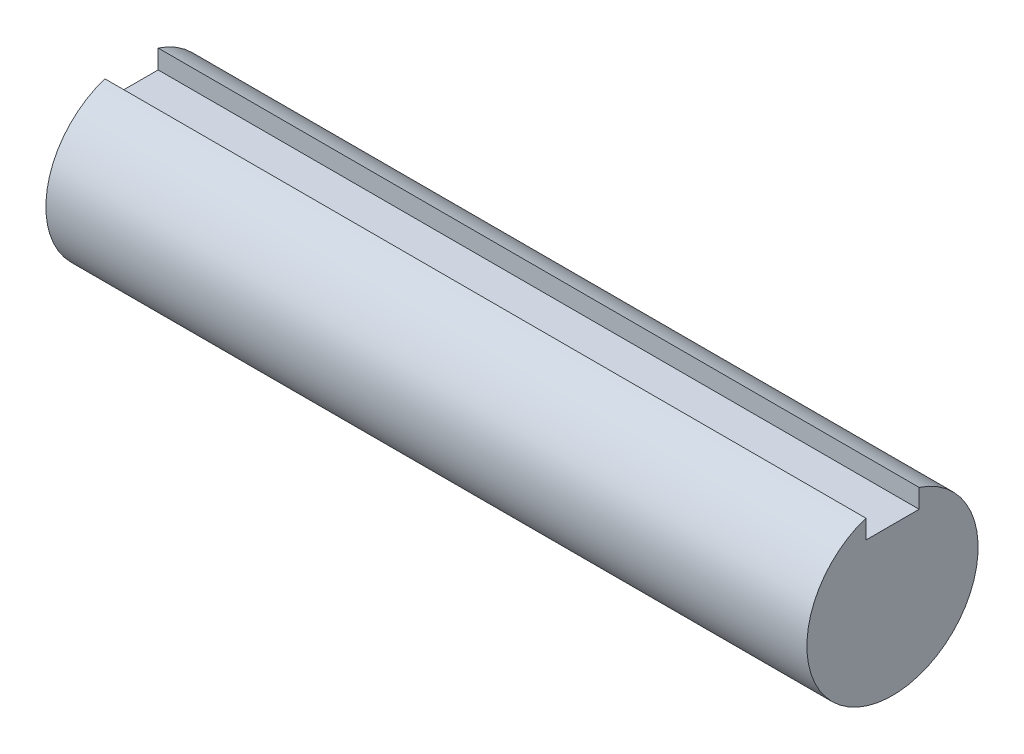
ISO-10303-21;
HEADER;
FILE_DESCRIPTION(('STEP AP214'),'2;1');
FILE_NAME('part.step','',(''),(''),'','','');
FILE_SCHEMA(('AUTOMOTIVE_DESIGN { 1 0 10303 214 1 1 1 1 }'));
ENDSEC;
DATA;
#1=APPLICATION_CONTEXT('core data for automotive mechanical design processes');
#2=APPLICATION_PROTOCOL_DEFINITION('international standard','automotive_design',2000,#1);
#3=PRODUCT_CONTEXT('',#1,'mechanical');
#4=PRODUCT('Part','Part','',(#3));
#5=PRODUCT_RELATED_PRODUCT_CATEGORY('part','',(#4));
#6=PRODUCT_DEFINITION_FORMATION('','',#4);
#7=PRODUCT_DEFINITION_CONTEXT('part definition',#1,'design');
#8=PRODUCT_DEFINITION('design','',#6,#7);
#9=PRODUCT_DEFINITION_SHAPE('','',#8);
#10=(LENGTH_UNIT() NAMED_UNIT(*) SI_UNIT(.MILLI.,.METRE.));
#11=(NAMED_UNIT(*) PLANE_ANGLE_UNIT() SI_UNIT($,.RADIAN.));
#12=(NAMED_UNIT(*) SI_UNIT($,.STERADIAN.) SOLID_ANGLE_UNIT());
#13=UNCERTAINTY_MEASURE_WITH_UNIT(LENGTH_MEASURE(1.E-05),#10,'distance_accuracy_value','');
#14=(GEOMETRIC_REPRESENTATION_CONTEXT(3) GLOBAL_UNCERTAINTY_ASSIGNED_CONTEXT((#13)) GLOBAL_UNIT_ASSIGNED_CONTEXT((#10,
#11,#12)) REPRESENTATION_CONTEXT('',''));
#15=CARTESIAN_POINT('',(0.,0.,0.));
#16=DIRECTION('',(0.,0.,1.));
#17=DIRECTION('',(1.,0.,0.));
#18=AXIS2_PLACEMENT_3D('',#15,#16,#17);
#19=CARTESIAN_POINT('',(200.,21.3834047803431,7.));
#20=DIRECTION('',(0.,0.,-1.));
#21=DIRECTION('',(-1.,0.,0.));
#22=AXIS2_PLACEMENT_3D('',#19,#20,#21);
#23=PLANE('',#22);
#24=DIRECTION('',(0.,-1.,0.));
#25=VECTOR('',#24,1.);
#26=CARTESIAN_POINT('',(0.,21.3834047803431,7.));
#27=LINE('',#26,#25);
#28=CARTESIAN_POINT('',(0.,21.3834047803431,7.));
#29=VERTEX_POINT('',#28);
#30=CARTESIAN_POINT('',(0.,16.4,7.));
#31=VERTEX_POINT('',#30);
#32=EDGE_CURVE('E102',#29,#31,#27,.T.);
#33=ORIENTED_EDGE('',*,*,#32,.F.);
#34=DIRECTION('',(-1.,0.,0.));
#35=VECTOR('',#34,1.);
#36=CARTESIAN_POINT('',(200.,21.3834047803431,7.));
#37=LINE('',#36,#35);
#38=CARTESIAN_POINT('',(200.,21.3834047803431,7.));
#39=VERTEX_POINT('',#38);
#40=EDGE_CURVE('E11',#39,#29,#37,.T.);
#41=ORIENTED_EDGE('',*,*,#40,.F.);
#42=DIRECTION('',(0.,-1.,0.));
#43=VECTOR('',#42,1.);
#44=CARTESIAN_POINT('',(200.,21.3834047803431,7.));
#45=LINE('',#44,#43);
#46=CARTESIAN_POINT('',(200.,16.4,7.));
#47=VERTEX_POINT('',#46);
#48=EDGE_CURVE('E97',#39,#47,#45,.T.);
#49=ORIENTED_EDGE('',*,*,#48,.T.);
#50=DIRECTION('',(-1.,0.,0.));
#51=VECTOR('',#50,1.);
#52=CARTESIAN_POINT('',(200.,16.4,7.));
#53=LINE('',#52,#51);
#54=EDGE_CURVE('E40',#47,#31,#53,.T.);
#55=ORIENTED_EDGE('',*,*,#54,.T.);
#56=EDGE_LOOP('',(#33,#41,#49,#55));
#57=FACE_BOUND('',#56,.T.);
#58=ADVANCED_FACE('F37',(#57),#23,.T.);
#59=CARTESIAN_POINT('',(200.,0.,0.));
#60=DIRECTION('',(-1.,0.,0.));
#61=DIRECTION('',(0.,0.,1.));
#62=AXIS2_PLACEMENT_3D('',#59,#60,#61);
#63=CYLINDRICAL_SURFACE('',#62,22.5);
#64=CARTESIAN_POINT('',(0.,0.,0.));
#65=DIRECTION('',(1.,0.,0.));
#66=DIRECTION('',(0.,0.,-1.));
#67=AXIS2_PLACEMENT_3D('',#64,#65,#66);
#68=CIRCLE('',#67,22.5);
#69=CARTESIAN_POINT('',(0.,21.3834047803431,-7.));
#70=VERTEX_POINT('',#69);
#71=EDGE_CURVE('E70',#29,#70,#68,.T.);
#72=ORIENTED_EDGE('',*,*,#71,.T.);
#73=DIRECTION('',(-1.,0.,0.));
#74=VECTOR('',#73,1.);
#75=CARTESIAN_POINT('',(200.,21.3834047803431,-7.));
#76=LINE('',#75,#74);
#77=CARTESIAN_POINT('',(200.,21.3834047803431,-7.));
#78=VERTEX_POINT('',#77);
#79=EDGE_CURVE('E46',#78,#70,#76,.T.);
#80=ORIENTED_EDGE('',*,*,#79,.F.);
#81=CARTESIAN_POINT('',(200.,0.,0.));
#82=DIRECTION('',(1.,0.,0.));
#83=DIRECTION('',(0.,0.,-1.));
#84=AXIS2_PLACEMENT_3D('',#81,#82,#83);
#85=CIRCLE('',#84,22.5);
#86=EDGE_CURVE('E87',#39,#78,#85,.T.);
#87=ORIENTED_EDGE('',*,*,#86,.F.);
#88=ORIENTED_EDGE('',*,*,#40,.T.);
#89=EDGE_LOOP('',(#72,#80,#87,#88));
#90=FACE_BOUND('',#89,.T.);
#91=ADVANCED_FACE('F112',(#90),#63,.T.);
#92=CARTESIAN_POINT('',(200.,21.3834047803431,-7.));
#93=DIRECTION('',(0.,0.,-1.));
#94=DIRECTION('',(0.,1.,0.));
#95=AXIS2_PLACEMENT_3D('',#92,#93,#94);
#96=PLANE('',#95);
#97=DIRECTION('',(0.,-1.,0.));
#98=VECTOR('',#97,1.);
#99=CARTESIAN_POINT('',(0.,21.3834047803431,-7.));
#100=LINE('',#99,#98);
#101=CARTESIAN_POINT('',(0.,16.4,-7.));
#102=VERTEX_POINT('',#101);
#103=EDGE_CURVE('E94',#70,#102,#100,.T.);
#104=ORIENTED_EDGE('',*,*,#103,.T.);
#105=DIRECTION('',(-1.,0.,0.));
#106=VECTOR('',#105,1.);
#107=CARTESIAN_POINT('',(200.,16.4,-7.));
#108=LINE('',#107,#106);
#109=CARTESIAN_POINT('',(200.,16.4,-7.));
#110=VERTEX_POINT('',#109);
#111=EDGE_CURVE('E91',#110,#102,#108,.T.);
#112=ORIENTED_EDGE('',*,*,#111,.F.);
#113=DIRECTION('',(0.,-1.,0.));
#114=VECTOR('',#113,1.);
#115=CARTESIAN_POINT('',(200.,21.3834047803431,-7.));
#116=LINE('',#115,#114);
#117=EDGE_CURVE('E82',#78,#110,#116,.T.);
#118=ORIENTED_EDGE('',*,*,#117,.F.);
#119=ORIENTED_EDGE('',*,*,#79,.T.);
#120=EDGE_LOOP('',(#104,#112,#118,#119));
#121=FACE_BOUND('',#120,.T.);
#122=ADVANCED_FACE('F92',(#121),#96,.F.);
#123=CARTESIAN_POINT('',(200.,16.4,7.));
#124=DIRECTION('',(0.,1.,0.));
#125=DIRECTION('',(0.,0.,1.));
#126=AXIS2_PLACEMENT_3D('',#123,#124,#125);
#127=PLANE('',#126);
#128=DIRECTION('',(0.,0.,-1.));
#129=VECTOR('',#128,1.);
#130=CARTESIAN_POINT('',(0.,16.4,7.));
#131=LINE('',#130,#129);
#132=EDGE_CURVE('E105',#31,#102,#131,.T.);
#133=ORIENTED_EDGE('',*,*,#132,.F.);
#134=ORIENTED_EDGE('',*,*,#54,.F.);
#135=DIRECTION('',(0.,0.,-1.));
#136=VECTOR('',#135,1.);
#137=CARTESIAN_POINT('',(200.,16.4,7.));
#138=LINE('',#137,#136);
#139=EDGE_CURVE('E86',#47,#110,#138,.T.);
#140=ORIENTED_EDGE('',*,*,#139,.T.);
#141=ORIENTED_EDGE('',*,*,#111,.T.);
#142=EDGE_LOOP('',(#133,#134,#140,#141));
#143=FACE_BOUND('',#142,.T.);
#144=ADVANCED_FACE('F96',(#143),#127,.T.);
#145=CARTESIAN_POINT('',(200.,0.,0.));
#146=DIRECTION('',(1.,0.,0.));
#147=DIRECTION('',(0.,0.,-1.));
#148=AXIS2_PLACEMENT_3D('',#145,#146,#147);
#149=PLANE('',#148);
#150=ORIENTED_EDGE('',*,*,#48,.F.);
#151=ORIENTED_EDGE('',*,*,#86,.T.);
#152=ORIENTED_EDGE('',*,*,#117,.T.);
#153=ORIENTED_EDGE('',*,*,#139,.F.);
#154=EDGE_LOOP('',(#150,#151,#152,#153));
#155=FACE_BOUND('',#154,.T.);
#156=ADVANCED_FACE('F85',(#155),#149,.T.);
#157=CARTESIAN_POINT('',(0.,0.,0.));
#158=DIRECTION('',(1.,0.,0.));
#159=DIRECTION('',(0.,0.,-1.));
#160=AXIS2_PLACEMENT_3D('',#157,#158,#159);
#161=PLANE('',#160);
#162=ORIENTED_EDGE('',*,*,#32,.T.);
#163=ORIENTED_EDGE('',*,*,#132,.T.);
#164=ORIENTED_EDGE('',*,*,#103,.F.);
#165=ORIENTED_EDGE('',*,*,#71,.F.);
#166=EDGE_LOOP('',(#162,#163,#164,#165));
#167=FACE_BOUND('',#166,.T.);
#168=ADVANCED_FACE('F110',(#167),#161,.F.);
#169=CLOSED_SHELL('',(#58,#91,#122,#144,#156,#168));
#170=MANIFOLD_SOLID_BREP('B2',#169);
#171=ADVANCED_BREP_SHAPE_REPRESENTATION('',(#18,#170),#14);
#172=SHAPE_DEFINITION_REPRESENTATION(#9,#171);
ENDSEC;
END-ISO-10303-21;
